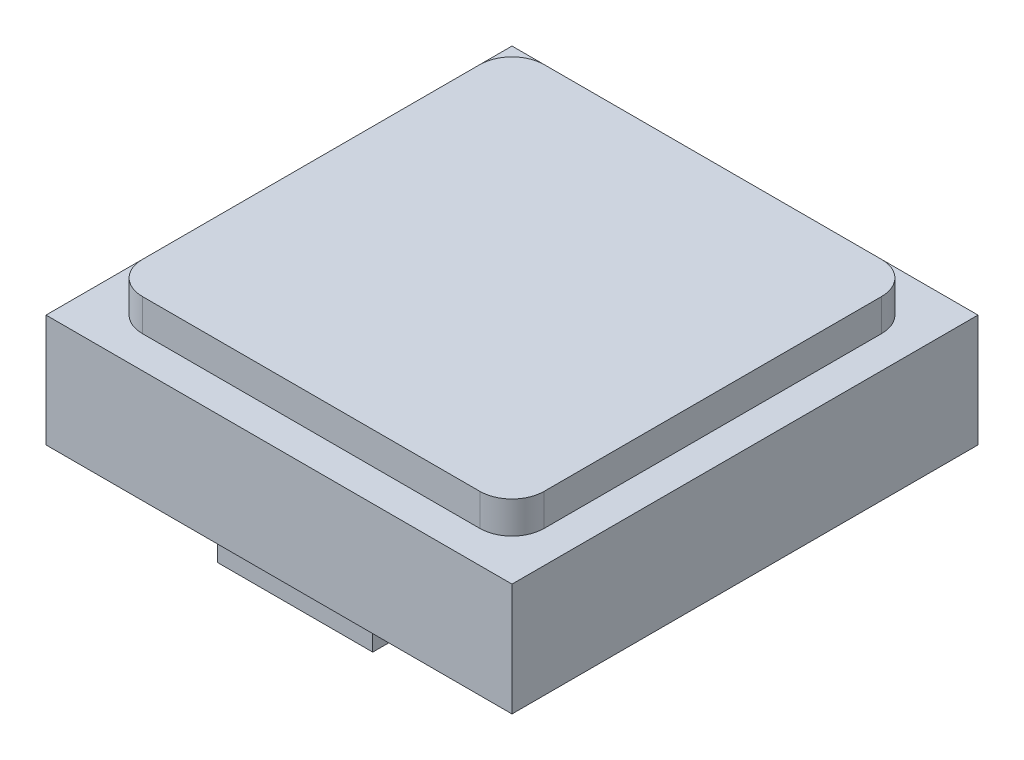
ISO-10303-21;
HEADER;
FILE_DESCRIPTION(('STEP AP214'),'2;1');
FILE_NAME('part.step','',(''),(''),'','','');
FILE_SCHEMA(('AUTOMOTIVE_DESIGN { 1 0 10303 214 1 1 1 1 }'));
ENDSEC;
DATA;
#1=APPLICATION_CONTEXT('core data for automotive mechanical design processes');
#2=APPLICATION_PROTOCOL_DEFINITION('international standard','automotive_design',2000,#1);
#3=PRODUCT_CONTEXT('',#1,'mechanical');
#4=PRODUCT('Part','Part','',(#3));
#5=PRODUCT_RELATED_PRODUCT_CATEGORY('part','',(#4));
#6=PRODUCT_DEFINITION_FORMATION('','',#4);
#7=PRODUCT_DEFINITION_CONTEXT('part definition',#1,'design');
#8=PRODUCT_DEFINITION('design','',#6,#7);
#9=PRODUCT_DEFINITION_SHAPE('','',#8);
#10=(LENGTH_UNIT() NAMED_UNIT(*) SI_UNIT(.MILLI.,.METRE.));
#11=(NAMED_UNIT(*) PLANE_ANGLE_UNIT() SI_UNIT($,.RADIAN.));
#12=(NAMED_UNIT(*) SI_UNIT($,.STERADIAN.) SOLID_ANGLE_UNIT());
#13=UNCERTAINTY_MEASURE_WITH_UNIT(LENGTH_MEASURE(1.E-05),#10,'distance_accuracy_value','');
#14=(GEOMETRIC_REPRESENTATION_CONTEXT(3) GLOBAL_UNCERTAINTY_ASSIGNED_CONTEXT((#13)) GLOBAL_UNIT_ASSIGNED_CONTEXT((#10,
#11,#12)) REPRESENTATION_CONTEXT('',''));
#15=CARTESIAN_POINT('',(0.,0.,0.));
#16=DIRECTION('',(0.,0.,1.));
#17=DIRECTION('',(1.,0.,0.));
#18=AXIS2_PLACEMENT_3D('',#15,#16,#17);
#19=CARTESIAN_POINT('',(0.,2.,0.));
#20=DIRECTION('',(0.,-1.,0.));
#21=DIRECTION('',(0.,0.,-1.));
#22=AXIS2_PLACEMENT_3D('',#19,#20,#21);
#23=PLANE('',#22);
#24=DIRECTION('',(1.,0.,0.));
#25=VECTOR('',#24,1.);
#26=CARTESIAN_POINT('',(12.5,2.,-12.5));
#27=LINE('',#26,#25);
#28=CARTESIAN_POINT('',(-12.5,2.,-12.5));
#29=VERTEX_POINT('',#28);
#30=CARTESIAN_POINT('',(12.5,2.,-12.5));
#31=VERTEX_POINT('',#30);
#32=EDGE_CURVE('E213',#29,#31,#27,.T.);
#33=ORIENTED_EDGE('',*,*,#32,.F.);
#34=DIRECTION('',(0.,0.,-1.));
#35=VECTOR('',#34,1.);
#36=CARTESIAN_POINT('',(-12.5,2.,-12.5));
#37=LINE('',#36,#35);
#38=CARTESIAN_POINT('',(-12.5,2.,5.5));
#39=VERTEX_POINT('',#38);
#40=EDGE_CURVE('E210',#39,#29,#37,.T.);
#41=ORIENTED_EDGE('',*,*,#40,.F.);
#42=DIRECTION('',(-1.,0.,0.));
#43=VECTOR('',#42,1.);
#44=CARTESIAN_POINT('',(12.5,2.,5.5));
#45=LINE('',#44,#43);
#46=CARTESIAN_POINT('',(12.5,2.,5.5));
#47=VERTEX_POINT('',#46);
#48=EDGE_CURVE('E206',#47,#39,#45,.T.);
#49=ORIENTED_EDGE('',*,*,#48,.F.);
#50=DIRECTION('',(0.,0.,1.));
#51=VECTOR('',#50,1.);
#52=CARTESIAN_POINT('',(12.5,2.,-12.5));
#53=LINE('',#52,#51);
#54=EDGE_CURVE('E203',#31,#47,#53,.T.);
#55=ORIENTED_EDGE('',*,*,#54,.F.);
#56=EDGE_LOOP('',(#33,#41,#49,#55));
#57=FACE_BOUND('',#56,.T.);
#58=DIRECTION('',(0.,0.,1.));
#59=VECTOR('',#58,1.);
#60=CARTESIAN_POINT('',(14.5,2.,-14.5));
#61=LINE('',#60,#59);
#62=CARTESIAN_POINT('',(14.5,2.,-14.5));
#63=VERTEX_POINT('',#62);
#64=CARTESIAN_POINT('',(14.5,2.,14.5));
#65=VERTEX_POINT('',#64);
#66=EDGE_CURVE('E57',#63,#65,#61,.T.);
#67=ORIENTED_EDGE('',*,*,#66,.T.);
#68=DIRECTION('',(-1.,0.,0.));
#69=VECTOR('',#68,1.);
#70=CARTESIAN_POINT('',(14.5,2.,14.5));
#71=LINE('',#70,#69);
#72=CARTESIAN_POINT('',(-14.5,2.,14.5));
#73=VERTEX_POINT('',#72);
#74=EDGE_CURVE('E233',#65,#73,#71,.T.);
#75=ORIENTED_EDGE('',*,*,#74,.T.);
#76=DIRECTION('',(0.,0.,-1.));
#77=VECTOR('',#76,1.);
#78=CARTESIAN_POINT('',(-14.5,2.,-14.5));
#79=LINE('',#78,#77);
#80=CARTESIAN_POINT('',(-14.5,2.,-14.5));
#81=VERTEX_POINT('',#80);
#82=EDGE_CURVE('E235',#73,#81,#79,.T.);
#83=ORIENTED_EDGE('',*,*,#82,.T.);
#84=DIRECTION('',(1.,0.,0.));
#85=VECTOR('',#84,1.);
#86=CARTESIAN_POINT('',(14.5,2.,-14.5));
#87=LINE('',#86,#85);
#88=EDGE_CURVE('E237',#81,#63,#87,.T.);
#89=ORIENTED_EDGE('',*,*,#88,.T.);
#90=EDGE_LOOP('',(#67,#75,#83,#89));
#91=FACE_BOUND('',#90,.T.);
#92=DIRECTION('',(-1.,0.,0.));
#93=VECTOR('',#92,1.);
#94=CARTESIAN_POINT('',(4.83333333333334,2.,13.5));
#95=LINE('',#94,#93);
#96=CARTESIAN_POINT('',(4.83333333333334,2.,13.5));
#97=VERTEX_POINT('',#96);
#98=CARTESIAN_POINT('',(-4.83333333333333,2.,13.5));
#99=VERTEX_POINT('',#98);
#100=EDGE_CURVE('E626',#97,#99,#95,.T.);
#101=ORIENTED_EDGE('',*,*,#100,.F.);
#102=DIRECTION('',(0.,0.,1.));
#103=VECTOR('',#102,1.);
#104=CARTESIAN_POINT('',(4.83333333333334,2.,9.5));
#105=LINE('',#104,#103);
#106=CARTESIAN_POINT('',(4.83333333333334,2.,9.5));
#107=VERTEX_POINT('',#106);
#108=EDGE_CURVE('E193',#107,#97,#105,.T.);
#109=ORIENTED_EDGE('',*,*,#108,.F.);
#110=DIRECTION('',(1.,0.,0.));
#111=VECTOR('',#110,1.);
#112=CARTESIAN_POINT('',(4.83333333333334,2.,9.5));
#113=LINE('',#112,#111);
#114=CARTESIAN_POINT('',(-4.83333333333333,2.,9.5));
#115=VERTEX_POINT('',#114);
#116=EDGE_CURVE('E189',#115,#107,#113,.T.);
#117=ORIENTED_EDGE('',*,*,#116,.F.);
#118=DIRECTION('',(0.,0.,-1.));
#119=VECTOR('',#118,1.);
#120=CARTESIAN_POINT('',(-4.83333333333333,2.,9.5));
#121=LINE('',#120,#119);
#122=EDGE_CURVE('E623',#99,#115,#121,.T.);
#123=ORIENTED_EDGE('',*,*,#122,.F.);
#124=EDGE_LOOP('',(#101,#109,#117,#123));
#125=FACE_BOUND('',#124,.T.);
#126=ADVANCED_FACE('F34',(#57,#91,#125),#23,.T.);
#127=CARTESIAN_POINT('',(14.5,11.,-14.5));
#128=DIRECTION('',(-1.,0.,0.));
#129=DIRECTION('',(0.,0.,1.));
#130=AXIS2_PLACEMENT_3D('',#127,#128,#129);
#131=PLANE('',#130);
#132=ORIENTED_EDGE('',*,*,#66,.F.);
#133=DIRECTION('',(0.,-1.,0.));
#134=VECTOR('',#133,1.);
#135=CARTESIAN_POINT('',(14.5,11.,-14.5));
#136=LINE('',#135,#134);
#137=CARTESIAN_POINT('',(14.5,9.,-14.5));
#138=VERTEX_POINT('',#137);
#139=EDGE_CURVE('E42',#138,#63,#136,.T.);
#140=ORIENTED_EDGE('',*,*,#139,.F.);
#141=DIRECTION('',(0.,0.,-1.));
#142=VECTOR('',#141,1.);
#143=CARTESIAN_POINT('',(14.5,9.,-14.5));
#144=LINE('',#143,#142);
#145=CARTESIAN_POINT('',(14.5,9.,14.5));
#146=VERTEX_POINT('',#145);
#147=EDGE_CURVE('E308',#146,#138,#144,.T.);
#148=ORIENTED_EDGE('',*,*,#147,.F.);
#149=DIRECTION('',(0.,-1.,0.));
#150=VECTOR('',#149,1.);
#151=CARTESIAN_POINT('',(14.5,11.,14.5));
#152=LINE('',#151,#150);
#153=EDGE_CURVE('E310',#146,#65,#152,.T.);
#154=ORIENTED_EDGE('',*,*,#153,.T.);
#155=EDGE_LOOP('',(#132,#140,#148,#154));
#156=FACE_BOUND('',#155,.T.);
#157=ADVANCED_FACE('F36',(#156),#131,.F.);
#158=CARTESIAN_POINT('',(-14.5,11.,-14.5));
#159=DIRECTION('',(0.,0.,1.));
#160=DIRECTION('',(1.,0.,0.));
#161=AXIS2_PLACEMENT_3D('',#158,#159,#160);
#162=PLANE('',#161);
#163=ORIENTED_EDGE('',*,*,#88,.F.);
#164=DIRECTION('',(0.,-1.,0.));
#165=VECTOR('',#164,1.);
#166=CARTESIAN_POINT('',(-14.5,11.,-14.5));
#167=LINE('',#166,#165);
#168=CARTESIAN_POINT('',(-14.5,9.,-14.5));
#169=VERTEX_POINT('',#168);
#170=EDGE_CURVE('E316',#169,#81,#167,.T.);
#171=ORIENTED_EDGE('',*,*,#170,.F.);
#172=DIRECTION('',(-1.,0.,0.));
#173=VECTOR('',#172,1.);
#174=CARTESIAN_POINT('',(-14.5,9.,-14.5));
#175=LINE('',#174,#173);
#176=EDGE_CURVE('E306',#138,#169,#175,.T.);
#177=ORIENTED_EDGE('',*,*,#176,.F.);
#178=ORIENTED_EDGE('',*,*,#139,.T.);
#179=EDGE_LOOP('',(#163,#171,#177,#178));
#180=FACE_BOUND('',#179,.T.);
#181=ADVANCED_FACE('F323',(#180),#162,.F.);
#182=CARTESIAN_POINT('',(-14.5,11.,-14.5));
#183=DIRECTION('',(1.,0.,0.));
#184=DIRECTION('',(0.,0.,-1.));
#185=AXIS2_PLACEMENT_3D('',#182,#183,#184);
#186=PLANE('',#185);
#187=ORIENTED_EDGE('',*,*,#82,.F.);
#188=DIRECTION('',(0.,-1.,0.));
#189=VECTOR('',#188,1.);
#190=CARTESIAN_POINT('',(-14.5,11.,14.5));
#191=LINE('',#190,#189);
#192=CARTESIAN_POINT('',(-14.5,9.,14.5));
#193=VERTEX_POINT('',#192);
#194=EDGE_CURVE('E313',#193,#73,#191,.T.);
#195=ORIENTED_EDGE('',*,*,#194,.F.);
#196=DIRECTION('',(0.,0.,1.));
#197=VECTOR('',#196,1.);
#198=CARTESIAN_POINT('',(-14.5,9.,-14.5));
#199=LINE('',#198,#197);
#200=EDGE_CURVE('E290',#169,#193,#199,.T.);
#201=ORIENTED_EDGE('',*,*,#200,.F.);
#202=ORIENTED_EDGE('',*,*,#170,.T.);
#203=EDGE_LOOP('',(#187,#195,#201,#202));
#204=FACE_BOUND('',#203,.T.);
#205=ADVANCED_FACE('F335',(#204),#186,.F.);
#206=CARTESIAN_POINT('',(-14.5,11.,14.5));
#207=DIRECTION('',(0.,0.,-1.));
#208=DIRECTION('',(-1.,0.,0.));
#209=AXIS2_PLACEMENT_3D('',#206,#207,#208);
#210=PLANE('',#209);
#211=ORIENTED_EDGE('',*,*,#74,.F.);
#212=ORIENTED_EDGE('',*,*,#153,.F.);
#213=DIRECTION('',(1.,0.,0.));
#214=VECTOR('',#213,1.);
#215=CARTESIAN_POINT('',(-14.5,9.,14.5));
#216=LINE('',#215,#214);
#217=EDGE_CURVE('E11',#193,#146,#216,.T.);
#218=ORIENTED_EDGE('',*,*,#217,.F.);
#219=ORIENTED_EDGE('',*,*,#194,.T.);
#220=EDGE_LOOP('',(#211,#212,#218,#219));
#221=FACE_BOUND('',#220,.T.);
#222=ADVANCED_FACE('F330',(#221),#210,.F.);
#223=CARTESIAN_POINT('',(-10.5,9.,-10.5));
#224=DIRECTION('',(0.,1.,0.));
#225=DIRECTION('',(0.,0.,1.));
#226=AXIS2_PLACEMENT_3D('',#223,#224,#225);
#227=PLANE('',#226);
#228=DIRECTION('',(1.,0.,0.));
#229=VECTOR('',#228,1.);
#230=CARTESIAN_POINT('',(-10.5,9.,12.5));
#231=LINE('',#230,#229);
#232=CARTESIAN_POINT('',(-10.5,9.,12.5));
#233=VERTEX_POINT('',#232);
#234=CARTESIAN_POINT('',(10.5,9.,12.5));
#235=VERTEX_POINT('',#234);
#236=EDGE_CURVE('E262',#233,#235,#231,.T.);
#237=ORIENTED_EDGE('',*,*,#236,.F.);
#238=CARTESIAN_POINT('',(-10.5,9.,10.5));
#239=DIRECTION('',(0.,1.,0.));
#240=DIRECTION('',(0.,0.,1.));
#241=AXIS2_PLACEMENT_3D('',#238,#239,#240);
#242=CIRCLE('',#241,2.);
#243=CARTESIAN_POINT('',(-12.5,9.,10.5));
#244=VERTEX_POINT('',#243);
#245=EDGE_CURVE('E259',#244,#233,#242,.T.);
#246=ORIENTED_EDGE('',*,*,#245,.F.);
#247=DIRECTION('',(0.,0.,1.));
#248=VECTOR('',#247,1.);
#249=CARTESIAN_POINT('',(-12.5,9.,-10.5));
#250=LINE('',#249,#248);
#251=CARTESIAN_POINT('',(-12.5,9.,-10.5));
#252=VERTEX_POINT('',#251);
#253=EDGE_CURVE('E256',#252,#244,#250,.T.);
#254=ORIENTED_EDGE('',*,*,#253,.F.);
#255=CARTESIAN_POINT('',(-10.5,9.,-10.5));
#256=DIRECTION('',(0.,1.,0.));
#257=DIRECTION('',(0.,0.,1.));
#258=AXIS2_PLACEMENT_3D('',#255,#256,#257);
#259=CIRCLE('',#258,2.);
#260=CARTESIAN_POINT('',(-10.5,9.,-12.5));
#261=VERTEX_POINT('',#260);
#262=EDGE_CURVE('E253',#261,#252,#259,.T.);
#263=ORIENTED_EDGE('',*,*,#262,.F.);
#264=DIRECTION('',(-1.,0.,0.));
#265=VECTOR('',#264,1.);
#266=CARTESIAN_POINT('',(-10.5,9.,-12.5));
#267=LINE('',#266,#265);
#268=CARTESIAN_POINT('',(10.5,9.,-12.5));
#269=VERTEX_POINT('',#268);
#270=EDGE_CURVE('E250',#269,#261,#267,.T.);
#271=ORIENTED_EDGE('',*,*,#270,.F.);
#272=CARTESIAN_POINT('',(10.5,9.,-10.5));
#273=DIRECTION('',(0.,1.,0.));
#274=DIRECTION('',(0.,0.,-1.));
#275=AXIS2_PLACEMENT_3D('',#272,#273,#274);
#276=CIRCLE('',#275,2.);
#277=CARTESIAN_POINT('',(12.5,9.,-10.5));
#278=VERTEX_POINT('',#277);
#279=EDGE_CURVE('E247',#278,#269,#276,.T.);
#280=ORIENTED_EDGE('',*,*,#279,.F.);
#281=DIRECTION('',(0.,0.,-1.));
#282=VECTOR('',#281,1.);
#283=CARTESIAN_POINT('',(12.5,9.,-10.5));
#284=LINE('',#283,#282);
#285=CARTESIAN_POINT('',(12.5,9.,10.5));
#286=VERTEX_POINT('',#285);
#287=EDGE_CURVE('E243',#286,#278,#284,.T.);
#288=ORIENTED_EDGE('',*,*,#287,.F.);
#289=CARTESIAN_POINT('',(10.5,9.,10.5));
#290=DIRECTION('',(0.,1.,0.));
#291=DIRECTION('',(0.,0.,1.));
#292=AXIS2_PLACEMENT_3D('',#289,#290,#291);
#293=CIRCLE('',#292,2.);
#294=EDGE_CURVE('E240',#235,#286,#293,.T.);
#295=ORIENTED_EDGE('',*,*,#294,.F.);
#296=EDGE_LOOP('',(#237,#246,#254,#263,#271,#280,#288,#295));
#297=FACE_BOUND('',#296,.T.);
#298=ORIENTED_EDGE('',*,*,#147,.T.);
#299=ORIENTED_EDGE('',*,*,#176,.T.);
#300=ORIENTED_EDGE('',*,*,#200,.T.);
#301=ORIENTED_EDGE('',*,*,#217,.T.);
#302=EDGE_LOOP('',(#298,#299,#300,#301));
#303=FACE_BOUND('',#302,.T.);
#304=ADVANCED_FACE('F338',(#297,#303),#227,.T.);
#305=CARTESIAN_POINT('',(10.5,9.,10.5));
#306=DIRECTION('',(0.,1.,0.));
#307=DIRECTION('',(0.,0.,1.));
#308=AXIS2_PLACEMENT_3D('',#305,#306,#307);
#309=CYLINDRICAL_SURFACE('',#308,2.);
#310=CARTESIAN_POINT('',(10.5,11.,10.5));
#311=DIRECTION('',(0.,1.,0.));
#312=DIRECTION('',(0.,0.,1.));
#313=AXIS2_PLACEMENT_3D('',#310,#311,#312);
#314=CIRCLE('',#313,2.);
#315=CARTESIAN_POINT('',(10.5,11.,12.5));
#316=VERTEX_POINT('',#315);
#317=CARTESIAN_POINT('',(12.5,11.,10.5));
#318=VERTEX_POINT('',#317);
#319=EDGE_CURVE('E239',#316,#318,#314,.T.);
#320=ORIENTED_EDGE('',*,*,#319,.F.);
#321=DIRECTION('',(0.,1.,0.));
#322=VECTOR('',#321,1.);
#323=CARTESIAN_POINT('',(10.5,9.,12.5));
#324=LINE('',#323,#322);
#325=EDGE_CURVE('E288',#235,#316,#324,.T.);
#326=ORIENTED_EDGE('',*,*,#325,.F.);
#327=ORIENTED_EDGE('',*,*,#294,.T.);
#328=DIRECTION('',(0.,1.,0.));
#329=VECTOR('',#328,1.);
#330=CARTESIAN_POINT('',(12.5,9.,10.5));
#331=LINE('',#330,#329);
#332=EDGE_CURVE('E265',#286,#318,#331,.T.);
#333=ORIENTED_EDGE('',*,*,#332,.T.);
#334=EDGE_LOOP('',(#320,#326,#327,#333));
#335=FACE_BOUND('',#334,.T.);
#336=ADVANCED_FACE('F340',(#335),#309,.T.);
#337=CARTESIAN_POINT('',(-10.5,9.,12.5));
#338=DIRECTION('',(0.,0.,1.));
#339=DIRECTION('',(1.,0.,0.));
#340=AXIS2_PLACEMENT_3D('',#337,#338,#339);
#341=PLANE('',#340);
#342=DIRECTION('',(1.,0.,0.));
#343=VECTOR('',#342,1.);
#344=CARTESIAN_POINT('',(-10.5,11.,12.5));
#345=LINE('',#344,#343);
#346=CARTESIAN_POINT('',(-10.5,11.,12.5));
#347=VERTEX_POINT('',#346);
#348=EDGE_CURVE('E244',#347,#316,#345,.T.);
#349=ORIENTED_EDGE('',*,*,#348,.F.);
#350=DIRECTION('',(0.,1.,0.));
#351=VECTOR('',#350,1.);
#352=CARTESIAN_POINT('',(-10.5,9.,12.5));
#353=LINE('',#352,#351);
#354=EDGE_CURVE('E291',#233,#347,#353,.T.);
#355=ORIENTED_EDGE('',*,*,#354,.F.);
#356=ORIENTED_EDGE('',*,*,#236,.T.);
#357=ORIENTED_EDGE('',*,*,#325,.T.);
#358=EDGE_LOOP('',(#349,#355,#356,#357));
#359=FACE_BOUND('',#358,.T.);
#360=ADVANCED_FACE('F347',(#359),#341,.T.);
#361=CARTESIAN_POINT('',(-10.5,9.,10.5));
#362=DIRECTION('',(0.,1.,0.));
#363=DIRECTION('',(0.,0.,1.));
#364=AXIS2_PLACEMENT_3D('',#361,#362,#363);
#365=CYLINDRICAL_SURFACE('',#364,2.);
#366=CARTESIAN_POINT('',(-10.5,11.,10.5));
#367=DIRECTION('',(0.,1.,0.));
#368=DIRECTION('',(0.,0.,1.));
#369=AXIS2_PLACEMENT_3D('',#366,#367,#368);
#370=CIRCLE('',#369,2.);
#371=CARTESIAN_POINT('',(-12.5,11.,10.5));
#372=VERTEX_POINT('',#371);
#373=EDGE_CURVE('E283',#372,#347,#370,.T.);
#374=ORIENTED_EDGE('',*,*,#373,.F.);
#375=DIRECTION('',(0.,1.,0.));
#376=VECTOR('',#375,1.);
#377=CARTESIAN_POINT('',(-12.5,9.,10.5));
#378=LINE('',#377,#376);
#379=EDGE_CURVE('E293',#244,#372,#378,.T.);
#380=ORIENTED_EDGE('',*,*,#379,.F.);
#381=ORIENTED_EDGE('',*,*,#245,.T.);
#382=ORIENTED_EDGE('',*,*,#354,.T.);
#383=EDGE_LOOP('',(#374,#380,#381,#382));
#384=FACE_BOUND('',#383,.T.);
#385=ADVANCED_FACE('F366',(#384),#365,.T.);
#386=CARTESIAN_POINT('',(-12.5,9.,-10.5));
#387=DIRECTION('',(-1.,0.,0.));
#388=DIRECTION('',(0.,0.,1.));
#389=AXIS2_PLACEMENT_3D('',#386,#387,#388);
#390=PLANE('',#389);
#391=DIRECTION('',(0.,0.,1.));
#392=VECTOR('',#391,1.);
#393=CARTESIAN_POINT('',(-12.5,11.,-10.5));
#394=LINE('',#393,#392);
#395=CARTESIAN_POINT('',(-12.5,11.,-10.5));
#396=VERTEX_POINT('',#395);
#397=EDGE_CURVE('E280',#396,#372,#394,.T.);
#398=ORIENTED_EDGE('',*,*,#397,.F.);
#399=DIRECTION('',(0.,1.,0.));
#400=VECTOR('',#399,1.);
#401=CARTESIAN_POINT('',(-12.5,9.,-10.5));
#402=LINE('',#401,#400);
#403=EDGE_CURVE('E295',#252,#396,#402,.T.);
#404=ORIENTED_EDGE('',*,*,#403,.F.);
#405=ORIENTED_EDGE('',*,*,#253,.T.);
#406=ORIENTED_EDGE('',*,*,#379,.T.);
#407=EDGE_LOOP('',(#398,#404,#405,#406));
#408=FACE_BOUND('',#407,.T.);
#409=ADVANCED_FACE('F370',(#408),#390,.T.);
#410=CARTESIAN_POINT('',(-10.5,9.,-10.5));
#411=DIRECTION('',(0.,1.,0.));
#412=DIRECTION('',(0.,0.,1.));
#413=AXIS2_PLACEMENT_3D('',#410,#411,#412);
#414=CYLINDRICAL_SURFACE('',#413,2.);
#415=CARTESIAN_POINT('',(-10.5,11.,-10.5));
#416=DIRECTION('',(0.,1.,0.));
#417=DIRECTION('',(0.,0.,1.));
#418=AXIS2_PLACEMENT_3D('',#415,#416,#417);
#419=CIRCLE('',#418,2.);
#420=CARTESIAN_POINT('',(-10.5,11.,-12.5));
#421=VERTEX_POINT('',#420);
#422=EDGE_CURVE('E277',#421,#396,#419,.T.);
#423=ORIENTED_EDGE('',*,*,#422,.F.);
#424=DIRECTION('',(0.,1.,0.));
#425=VECTOR('',#424,1.);
#426=CARTESIAN_POINT('',(-10.5,9.,-12.5));
#427=LINE('',#426,#425);
#428=EDGE_CURVE('E297',#261,#421,#427,.T.);
#429=ORIENTED_EDGE('',*,*,#428,.F.);
#430=ORIENTED_EDGE('',*,*,#262,.T.);
#431=ORIENTED_EDGE('',*,*,#403,.T.);
#432=EDGE_LOOP('',(#423,#429,#430,#431));
#433=FACE_BOUND('',#432,.T.);
#434=ADVANCED_FACE('F374',(#433),#414,.T.);
#435=CARTESIAN_POINT('',(-10.5,9.,-12.5));
#436=DIRECTION('',(0.,0.,-1.));
#437=DIRECTION('',(-1.,0.,0.));
#438=AXIS2_PLACEMENT_3D('',#435,#436,#437);
#439=PLANE('',#438);
#440=DIRECTION('',(-1.,0.,0.));
#441=VECTOR('',#440,1.);
#442=CARTESIAN_POINT('',(-10.5,11.,-12.5));
#443=LINE('',#442,#441);
#444=CARTESIAN_POINT('',(10.5,11.,-12.5));
#445=VERTEX_POINT('',#444);
#446=EDGE_CURVE('E274',#445,#421,#443,.T.);
#447=ORIENTED_EDGE('',*,*,#446,.F.);
#448=DIRECTION('',(0.,1.,0.));
#449=VECTOR('',#448,1.);
#450=CARTESIAN_POINT('',(10.5,9.,-12.5));
#451=LINE('',#450,#449);
#452=EDGE_CURVE('E299',#269,#445,#451,.T.);
#453=ORIENTED_EDGE('',*,*,#452,.F.);
#454=ORIENTED_EDGE('',*,*,#270,.T.);
#455=ORIENTED_EDGE('',*,*,#428,.T.);
#456=EDGE_LOOP('',(#447,#453,#454,#455));
#457=FACE_BOUND('',#456,.T.);
#458=ADVANCED_FACE('F378',(#457),#439,.T.);
#459=CARTESIAN_POINT('',(10.5,9.,-10.5));
#460=DIRECTION('',(0.,1.,0.));
#461=DIRECTION('',(0.,0.,1.));
#462=AXIS2_PLACEMENT_3D('',#459,#460,#461);
#463=CYLINDRICAL_SURFACE('',#462,2.);
#464=CARTESIAN_POINT('',(10.5,11.,-10.5));
#465=DIRECTION('',(0.,1.,0.));
#466=DIRECTION('',(0.,0.,-1.));
#467=AXIS2_PLACEMENT_3D('',#464,#465,#466);
#468=CIRCLE('',#467,2.);
#469=CARTESIAN_POINT('',(12.5,11.,-10.5));
#470=VERTEX_POINT('',#469);
#471=EDGE_CURVE('E271',#470,#445,#468,.T.);
#472=ORIENTED_EDGE('',*,*,#471,.F.);
#473=DIRECTION('',(0.,1.,0.));
#474=VECTOR('',#473,1.);
#475=CARTESIAN_POINT('',(12.5,9.,-10.5));
#476=LINE('',#475,#474);
#477=EDGE_CURVE('E301',#278,#470,#476,.T.);
#478=ORIENTED_EDGE('',*,*,#477,.F.);
#479=ORIENTED_EDGE('',*,*,#279,.T.);
#480=ORIENTED_EDGE('',*,*,#452,.T.);
#481=EDGE_LOOP('',(#472,#478,#479,#480));
#482=FACE_BOUND('',#481,.T.);
#483=ADVANCED_FACE('F382',(#482),#463,.T.);
#484=CARTESIAN_POINT('',(12.5,9.,-10.5));
#485=DIRECTION('',(1.,0.,0.));
#486=DIRECTION('',(0.,0.,-1.));
#487=AXIS2_PLACEMENT_3D('',#484,#485,#486);
#488=PLANE('',#487);
#489=DIRECTION('',(0.,0.,-1.));
#490=VECTOR('',#489,1.);
#491=CARTESIAN_POINT('',(12.5,11.,-10.5));
#492=LINE('',#491,#490);
#493=EDGE_CURVE('E268',#318,#470,#492,.T.);
#494=ORIENTED_EDGE('',*,*,#493,.F.);
#495=ORIENTED_EDGE('',*,*,#332,.F.);
#496=ORIENTED_EDGE('',*,*,#287,.T.);
#497=ORIENTED_EDGE('',*,*,#477,.T.);
#498=EDGE_LOOP('',(#494,#495,#496,#497));
#499=FACE_BOUND('',#498,.T.);
#500=ADVANCED_FACE('F386',(#499),#488,.T.);
#501=CARTESIAN_POINT('',(0.,11.,0.));
#502=DIRECTION('',(0.,1.,0.));
#503=DIRECTION('',(0.,0.,1.));
#504=AXIS2_PLACEMENT_3D('',#501,#502,#503);
#505=PLANE('',#504);
#506=ORIENTED_EDGE('',*,*,#348,.T.);
#507=ORIENTED_EDGE('',*,*,#319,.T.);
#508=ORIENTED_EDGE('',*,*,#493,.T.);
#509=ORIENTED_EDGE('',*,*,#471,.T.);
#510=ORIENTED_EDGE('',*,*,#446,.T.);
#511=ORIENTED_EDGE('',*,*,#422,.T.);
#512=ORIENTED_EDGE('',*,*,#397,.T.);
#513=ORIENTED_EDGE('',*,*,#373,.T.);
#514=EDGE_LOOP('',(#506,#507,#508,#509,#510,#511,#512,#513));
#515=FACE_BOUND('',#514,.T.);
#516=ADVANCED_FACE('F389',(#515),#505,.T.);
#517=CARTESIAN_POINT('',(12.5,2.,-12.5));
#518=DIRECTION('',(1.,0.,0.));
#519=DIRECTION('',(0.,0.,-1.));
#520=AXIS2_PLACEMENT_3D('',#517,#518,#519);
#521=PLANE('',#520);
#522=DIRECTION('',(0.,0.,1.));
#523=VECTOR('',#522,1.);
#524=CARTESIAN_POINT('',(12.5,0.,-12.5));
#525=LINE('',#524,#523);
#526=CARTESIAN_POINT('',(12.5,0.,-12.5));
#527=VERTEX_POINT('',#526);
#528=CARTESIAN_POINT('',(12.5,0.,5.5));
#529=VERTEX_POINT('',#528);
#530=EDGE_CURVE('E195',#527,#529,#525,.T.);
#531=ORIENTED_EDGE('',*,*,#530,.F.);
#532=DIRECTION('',(0.,-1.,0.));
#533=VECTOR('',#532,1.);
#534=CARTESIAN_POINT('',(12.5,2.,-12.5));
#535=LINE('',#534,#533);
#536=EDGE_CURVE('E224',#31,#527,#535,.T.);
#537=ORIENTED_EDGE('',*,*,#536,.F.);
#538=ORIENTED_EDGE('',*,*,#54,.T.);
#539=DIRECTION('',(0.,-1.,0.));
#540=VECTOR('',#539,1.);
#541=CARTESIAN_POINT('',(12.5,2.,5.5));
#542=LINE('',#541,#540);
#543=EDGE_CURVE('E215',#47,#529,#542,.T.);
#544=ORIENTED_EDGE('',*,*,#543,.T.);
#545=EDGE_LOOP('',(#531,#537,#538,#544));
#546=FACE_BOUND('',#545,.T.);
#547=ADVANCED_FACE('F362',(#546),#521,.T.);
#548=CARTESIAN_POINT('',(12.5,2.,-12.5));
#549=DIRECTION('',(0.,0.,-1.));
#550=DIRECTION('',(-1.,0.,0.));
#551=AXIS2_PLACEMENT_3D('',#548,#549,#550);
#552=PLANE('',#551);
#553=DIRECTION('',(1.,0.,0.));
#554=VECTOR('',#553,1.);
#555=CARTESIAN_POINT('',(12.5,0.,-12.5));
#556=LINE('',#555,#554);
#557=CARTESIAN_POINT('',(-12.5,0.,-12.5));
#558=VERTEX_POINT('',#557);
#559=EDGE_CURVE('E207',#558,#527,#556,.T.);
#560=ORIENTED_EDGE('',*,*,#559,.F.);
#561=DIRECTION('',(0.,-1.,0.));
#562=VECTOR('',#561,1.);
#563=CARTESIAN_POINT('',(-12.5,2.,-12.5));
#564=LINE('',#563,#562);
#565=EDGE_CURVE('E226',#29,#558,#564,.T.);
#566=ORIENTED_EDGE('',*,*,#565,.F.);
#567=ORIENTED_EDGE('',*,*,#32,.T.);
#568=ORIENTED_EDGE('',*,*,#536,.T.);
#569=EDGE_LOOP('',(#560,#566,#567,#568));
#570=FACE_BOUND('',#569,.T.);
#571=ADVANCED_FACE('F412',(#570),#552,.T.);
#572=CARTESIAN_POINT('',(-12.5,2.,-12.5));
#573=DIRECTION('',(-1.,0.,0.));
#574=DIRECTION('',(0.,0.,1.));
#575=AXIS2_PLACEMENT_3D('',#572,#573,#574);
#576=PLANE('',#575);
#577=DIRECTION('',(0.,0.,-1.));
#578=VECTOR('',#577,1.);
#579=CARTESIAN_POINT('',(-12.5,0.,-12.5));
#580=LINE('',#579,#578);
#581=CARTESIAN_POINT('',(-12.5,0.,5.5));
#582=VERTEX_POINT('',#581);
#583=EDGE_CURVE('E219',#582,#558,#580,.T.);
#584=ORIENTED_EDGE('',*,*,#583,.F.);
#585=DIRECTION('',(0.,-1.,0.));
#586=VECTOR('',#585,1.);
#587=CARTESIAN_POINT('',(-12.5,2.,5.5));
#588=LINE('',#587,#586);
#589=EDGE_CURVE('E228',#39,#582,#588,.T.);
#590=ORIENTED_EDGE('',*,*,#589,.F.);
#591=ORIENTED_EDGE('',*,*,#40,.T.);
#592=ORIENTED_EDGE('',*,*,#565,.T.);
#593=EDGE_LOOP('',(#584,#590,#591,#592));
#594=FACE_BOUND('',#593,.T.);
#595=ADVANCED_FACE('F451',(#594),#576,.T.);
#596=CARTESIAN_POINT('',(12.5,2.,5.5));
#597=DIRECTION('',(0.,0.,1.));
#598=DIRECTION('',(1.,0.,0.));
#599=AXIS2_PLACEMENT_3D('',#596,#597,#598);
#600=PLANE('',#599);
#601=DIRECTION('',(-1.,0.,0.));
#602=VECTOR('',#601,1.);
#603=CARTESIAN_POINT('',(12.5,0.,5.5));
#604=LINE('',#603,#602);
#605=EDGE_CURVE('E198',#529,#582,#604,.T.);
#606=ORIENTED_EDGE('',*,*,#605,.F.);
#607=ORIENTED_EDGE('',*,*,#543,.F.);
#608=ORIENTED_EDGE('',*,*,#48,.T.);
#609=ORIENTED_EDGE('',*,*,#589,.T.);
#610=EDGE_LOOP('',(#606,#607,#608,#609));
#611=FACE_BOUND('',#610,.T.);
#612=ADVANCED_FACE('F417',(#611),#600,.T.);
#613=CARTESIAN_POINT('',(0.,0.,0.));
#614=DIRECTION('',(0.,1.,0.));
#615=DIRECTION('',(0.,0.,1.));
#616=AXIS2_PLACEMENT_3D('',#613,#614,#615);
#617=PLANE('',#616);
#618=ORIENTED_EDGE('',*,*,#530,.T.);
#619=ORIENTED_EDGE('',*,*,#605,.T.);
#620=ORIENTED_EDGE('',*,*,#583,.T.);
#621=ORIENTED_EDGE('',*,*,#559,.T.);
#622=EDGE_LOOP('',(#618,#619,#620,#621));
#623=FACE_BOUND('',#622,.T.);
#624=ADVANCED_FACE('F415',(#623),#617,.F.);
#625=CARTESIAN_POINT('',(4.83333333333334,0.,9.5));
#626=DIRECTION('',(-1.,0.,0.));
#627=DIRECTION('',(0.,0.,1.));
#628=AXIS2_PLACEMENT_3D('',#625,#626,#627);
#629=PLANE('',#628);
#630=ORIENTED_EDGE('',*,*,#108,.T.);
#631=DIRECTION('',(0.,1.,0.));
#632=VECTOR('',#631,1.);
#633=CARTESIAN_POINT('',(4.83333333333334,0.,13.5));
#634=LINE('',#633,#632);
#635=CARTESIAN_POINT('',(4.83333333333334,0.,13.5));
#636=VERTEX_POINT('',#635);
#637=EDGE_CURVE('E174',#636,#97,#634,.T.);
#638=ORIENTED_EDGE('',*,*,#637,.F.);
#639=DIRECTION('',(0.,0.,1.));
#640=VECTOR('',#639,1.);
#641=CARTESIAN_POINT('',(4.83333333333334,0.,9.5));
#642=LINE('',#641,#640);
#643=CARTESIAN_POINT('',(4.83333333333334,0.,9.5));
#644=VERTEX_POINT('',#643);
#645=EDGE_CURVE('E181',#644,#636,#642,.T.);
#646=ORIENTED_EDGE('',*,*,#645,.F.);
#647=DIRECTION('',(0.,1.,0.));
#648=VECTOR('',#647,1.);
#649=CARTESIAN_POINT('',(4.83333333333334,0.,9.5));
#650=LINE('',#649,#648);
#651=EDGE_CURVE('E621',#644,#107,#650,.T.);
#652=ORIENTED_EDGE('',*,*,#651,.T.);
#653=EDGE_LOOP('',(#630,#638,#646,#652));
#654=FACE_BOUND('',#653,.T.);
#655=ADVANCED_FACE('F191',(#654),#629,.F.);
#656=CARTESIAN_POINT('',(4.83333333333334,0.,13.5));
#657=DIRECTION('',(0.,0.,-1.));
#658=DIRECTION('',(-1.,0.,0.));
#659=AXIS2_PLACEMENT_3D('',#656,#657,#658);
#660=PLANE('',#659);
#661=ORIENTED_EDGE('',*,*,#100,.T.);
#662=DIRECTION('',(0.,1.,0.));
#663=VECTOR('',#662,1.);
#664=CARTESIAN_POINT('',(-4.83333333333333,0.,13.5));
#665=LINE('',#664,#663);
#666=CARTESIAN_POINT('',(-4.83333333333333,0.,13.5));
#667=VERTEX_POINT('',#666);
#668=EDGE_CURVE('E177',#667,#99,#665,.T.);
#669=ORIENTED_EDGE('',*,*,#668,.F.);
#670=DIRECTION('',(-1.,0.,0.));
#671=VECTOR('',#670,1.);
#672=CARTESIAN_POINT('',(4.83333333333334,0.,13.5));
#673=LINE('',#672,#671);
#674=EDGE_CURVE('E170',#636,#667,#673,.T.);
#675=ORIENTED_EDGE('',*,*,#674,.F.);
#676=ORIENTED_EDGE('',*,*,#637,.T.);
#677=EDGE_LOOP('',(#661,#669,#675,#676));
#678=FACE_BOUND('',#677,.T.);
#679=ADVANCED_FACE('F172',(#678),#660,.F.);
#680=CARTESIAN_POINT('',(-4.83333333333333,0.,9.5));
#681=DIRECTION('',(1.,0.,0.));
#682=DIRECTION('',(0.,0.,-1.));
#683=AXIS2_PLACEMENT_3D('',#680,#681,#682);
#684=PLANE('',#683);
#685=ORIENTED_EDGE('',*,*,#122,.T.);
#686=DIRECTION('',(0.,1.,0.));
#687=VECTOR('',#686,1.);
#688=CARTESIAN_POINT('',(-4.83333333333333,0.,9.5));
#689=LINE('',#688,#687);
#690=CARTESIAN_POINT('',(-4.83333333333333,0.,9.5));
#691=VERTEX_POINT('',#690);
#692=EDGE_CURVE('E49',#691,#115,#689,.T.);
#693=ORIENTED_EDGE('',*,*,#692,.F.);
#694=DIRECTION('',(0.,0.,-1.));
#695=VECTOR('',#694,1.);
#696=CARTESIAN_POINT('',(-4.83333333333333,0.,9.5));
#697=LINE('',#696,#695);
#698=EDGE_CURVE('E180',#667,#691,#697,.T.);
#699=ORIENTED_EDGE('',*,*,#698,.F.);
#700=ORIENTED_EDGE('',*,*,#668,.T.);
#701=EDGE_LOOP('',(#685,#693,#699,#700));
#702=FACE_BOUND('',#701,.T.);
#703=ADVANCED_FACE('F503',(#702),#684,.F.);
#704=CARTESIAN_POINT('',(4.83333333333334,0.,9.5));
#705=DIRECTION('',(0.,0.,1.));
#706=DIRECTION('',(1.,0.,0.));
#707=AXIS2_PLACEMENT_3D('',#704,#705,#706);
#708=PLANE('',#707);
#709=ORIENTED_EDGE('',*,*,#116,.T.);
#710=ORIENTED_EDGE('',*,*,#651,.F.);
#711=DIRECTION('',(1.,0.,0.));
#712=VECTOR('',#711,1.);
#713=CARTESIAN_POINT('',(4.83333333333334,0.,9.5));
#714=LINE('',#713,#712);
#715=EDGE_CURVE('E185',#691,#644,#714,.T.);
#716=ORIENTED_EDGE('',*,*,#715,.F.);
#717=ORIENTED_EDGE('',*,*,#692,.T.);
#718=EDGE_LOOP('',(#709,#710,#716,#717));
#719=FACE_BOUND('',#718,.T.);
#720=ADVANCED_FACE('F513',(#719),#708,.F.);
#721=CARTESIAN_POINT('',(0.,0.,0.));
#722=DIRECTION('',(0.,-1.,0.));
#723=DIRECTION('',(0.,0.,-1.));
#724=AXIS2_PLACEMENT_3D('',#721,#722,#723);
#725=PLANE('',#724);
#726=ORIENTED_EDGE('',*,*,#645,.T.);
#727=ORIENTED_EDGE('',*,*,#674,.T.);
#728=ORIENTED_EDGE('',*,*,#698,.T.);
#729=ORIENTED_EDGE('',*,*,#715,.T.);
#730=EDGE_LOOP('',(#726,#727,#728,#729));
#731=FACE_BOUND('',#730,.T.);
#732=ADVANCED_FACE('F184',(#731),#725,.T.);
#733=CLOSED_SHELL('',(#126,#157,#181,#205,#222,#304,#336,#360,#385,#409,#434,#458,#483,#500,
#516,#547,#571,#595,#612,#624,#655,#679,#703,#720,#732));
#734=MANIFOLD_SOLID_BREP('B2',#733);
#735=ADVANCED_BREP_SHAPE_REPRESENTATION('',(#18,#734),#14);
#736=SHAPE_DEFINITION_REPRESENTATION(#9,#735);
ENDSEC;
END-ISO-10303-21;
